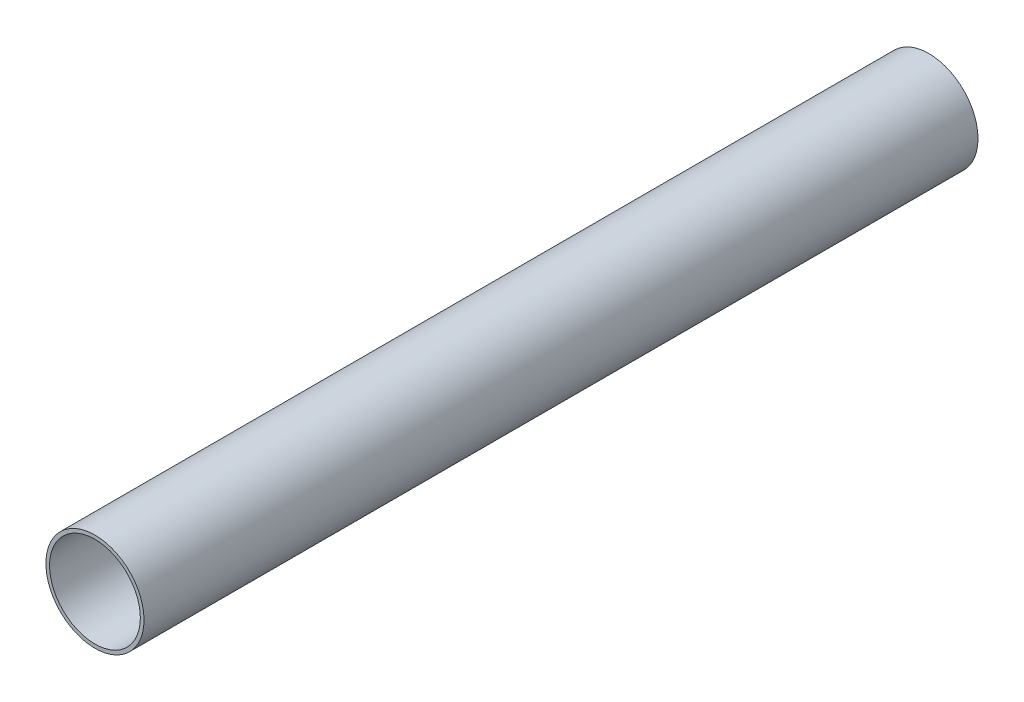
ISO-10303-21;
HEADER;
FILE_DESCRIPTION(('STEP AP214'),'2;1');
FILE_NAME('part.step','',(''),(''),'','','');
FILE_SCHEMA(('AUTOMOTIVE_DESIGN { 1 0 10303 214 1 1 1 1 }'));
ENDSEC;
DATA;
#1=APPLICATION_CONTEXT('core data for automotive mechanical design processes');
#2=APPLICATION_PROTOCOL_DEFINITION('international standard','automotive_design',2000,#1);
#3=PRODUCT_CONTEXT('',#1,'mechanical');
#4=PRODUCT('Part','Part','',(#3));
#5=PRODUCT_RELATED_PRODUCT_CATEGORY('part','',(#4));
#6=PRODUCT_DEFINITION_FORMATION('','',#4);
#7=PRODUCT_DEFINITION_CONTEXT('part definition',#1,'design');
#8=PRODUCT_DEFINITION('design','',#6,#7);
#9=PRODUCT_DEFINITION_SHAPE('','',#8);
#10=(LENGTH_UNIT() NAMED_UNIT(*) SI_UNIT(.MILLI.,.METRE.));
#11=(NAMED_UNIT(*) PLANE_ANGLE_UNIT() SI_UNIT($,.RADIAN.));
#12=(NAMED_UNIT(*) SI_UNIT($,.STERADIAN.) SOLID_ANGLE_UNIT());
#13=UNCERTAINTY_MEASURE_WITH_UNIT(LENGTH_MEASURE(1.E-05),#10,'distance_accuracy_value','');
#14=(GEOMETRIC_REPRESENTATION_CONTEXT(3) GLOBAL_UNCERTAINTY_ASSIGNED_CONTEXT((#13)) GLOBAL_UNIT_ASSIGNED_CONTEXT((#10,
#11,#12)) REPRESENTATION_CONTEXT('',''));
#15=CARTESIAN_POINT('',(0.,0.,0.));
#16=DIRECTION('',(0.,0.,1.));
#17=DIRECTION('',(1.,0.,0.));
#18=AXIS2_PLACEMENT_3D('',#15,#16,#17);
#19=CARTESIAN_POINT('',(0.,0.,136.));
#20=DIRECTION('',(0.,0.,1.));
#21=DIRECTION('',(1.,0.,0.));
#22=AXIS2_PLACEMENT_3D('',#19,#20,#21);
#23=PLANE('',#22);
#24=CARTESIAN_POINT('',(0.,0.,136.));
#25=DIRECTION('',(0.,0.,1.));
#26=DIRECTION('',(1.,0.,0.));
#27=AXIS2_PLACEMENT_3D('',#24,#25,#26);
#28=CIRCLE('',#27,8.);
#29=CARTESIAN_POINT('',(8.,0.,136.));
#30=VERTEX_POINT('',#29);
#31=EDGE_CURVE('E12',#30,#30,#28,.T.);
#32=ORIENTED_EDGE('',*,*,#31,.T.);
#33=EDGE_LOOP('',(#32));
#34=FACE_BOUND('',#33,.T.);
#35=CARTESIAN_POINT('',(0.,0.,136.));
#36=DIRECTION('',(0.,0.,1.));
#37=DIRECTION('',(1.,0.,0.));
#38=AXIS2_PLACEMENT_3D('',#35,#36,#37);
#39=CIRCLE('',#38,7.4);
#40=CARTESIAN_POINT('',(7.4,0.,136.));
#41=VERTEX_POINT('',#40);
#42=EDGE_CURVE('E51',#41,#41,#39,.T.);
#43=ORIENTED_EDGE('',*,*,#42,.F.);
#44=EDGE_LOOP('',(#43));
#45=FACE_BOUND('',#44,.T.);
#46=ADVANCED_FACE('F40',(#34,#45),#23,.T.);
#47=CARTESIAN_POINT('',(0.,0.,0.));
#48=DIRECTION('',(0.,0.,1.));
#49=DIRECTION('',(1.,0.,0.));
#50=AXIS2_PLACEMENT_3D('',#47,#48,#49);
#51=PLANE('',#50);
#52=CARTESIAN_POINT('',(0.,0.,0.));
#53=DIRECTION('',(0.,0.,1.));
#54=DIRECTION('',(1.,0.,0.));
#55=AXIS2_PLACEMENT_3D('',#52,#53,#54);
#56=CIRCLE('',#55,8.);
#57=CARTESIAN_POINT('',(8.,0.,0.));
#58=VERTEX_POINT('',#57);
#59=EDGE_CURVE('E44',#58,#58,#56,.T.);
#60=ORIENTED_EDGE('',*,*,#59,.F.);
#61=EDGE_LOOP('',(#60));
#62=FACE_BOUND('',#61,.T.);
#63=CARTESIAN_POINT('',(0.,0.,0.));
#64=DIRECTION('',(0.,0.,1.));
#65=DIRECTION('',(1.,0.,0.));
#66=AXIS2_PLACEMENT_3D('',#63,#64,#65);
#67=CIRCLE('',#66,7.4);
#68=CARTESIAN_POINT('',(7.4,0.,0.));
#69=VERTEX_POINT('',#68);
#70=EDGE_CURVE('E53',#69,#69,#67,.T.);
#71=ORIENTED_EDGE('',*,*,#70,.T.);
#72=EDGE_LOOP('',(#71));
#73=FACE_BOUND('',#72,.T.);
#74=ADVANCED_FACE('F63',(#62,#73),#51,.F.);
#75=CARTESIAN_POINT('',(0.,0.,136.));
#76=DIRECTION('',(0.,0.,-1.));
#77=DIRECTION('',(-1.,0.,0.));
#78=AXIS2_PLACEMENT_3D('',#75,#76,#77);
#79=CYLINDRICAL_SURFACE('',#78,8.);
#80=ORIENTED_EDGE('',*,*,#31,.F.);
#81=EDGE_LOOP('',(#80));
#82=FACE_BOUND('',#81,.T.);
#83=ORIENTED_EDGE('',*,*,#59,.T.);
#84=EDGE_LOOP('',(#83));
#85=FACE_BOUND('',#84,.T.);
#86=ADVANCED_FACE('F42',(#82,#85),#79,.T.);
#87=CARTESIAN_POINT('',(0.,0.,136.));
#88=DIRECTION('',(0.,0.,-1.));
#89=DIRECTION('',(-1.,0.,0.));
#90=AXIS2_PLACEMENT_3D('',#87,#88,#89);
#91=CYLINDRICAL_SURFACE('',#90,7.4);
#92=ORIENTED_EDGE('',*,*,#42,.T.);
#93=EDGE_LOOP('',(#92));
#94=FACE_BOUND('',#93,.T.);
#95=ORIENTED_EDGE('',*,*,#70,.F.);
#96=EDGE_LOOP('',(#95));
#97=FACE_BOUND('',#96,.T.);
#98=ADVANCED_FACE('F59',(#94,#97),#91,.F.);
#99=CLOSED_SHELL('',(#46,#74,#86,#98));
#100=MANIFOLD_SOLID_BREP('B2',#99);
#101=ADVANCED_BREP_SHAPE_REPRESENTATION('',(#18,#100),#14);
#102=SHAPE_DEFINITION_REPRESENTATION(#9,#101);
ENDSEC;
END-ISO-10303-21;
